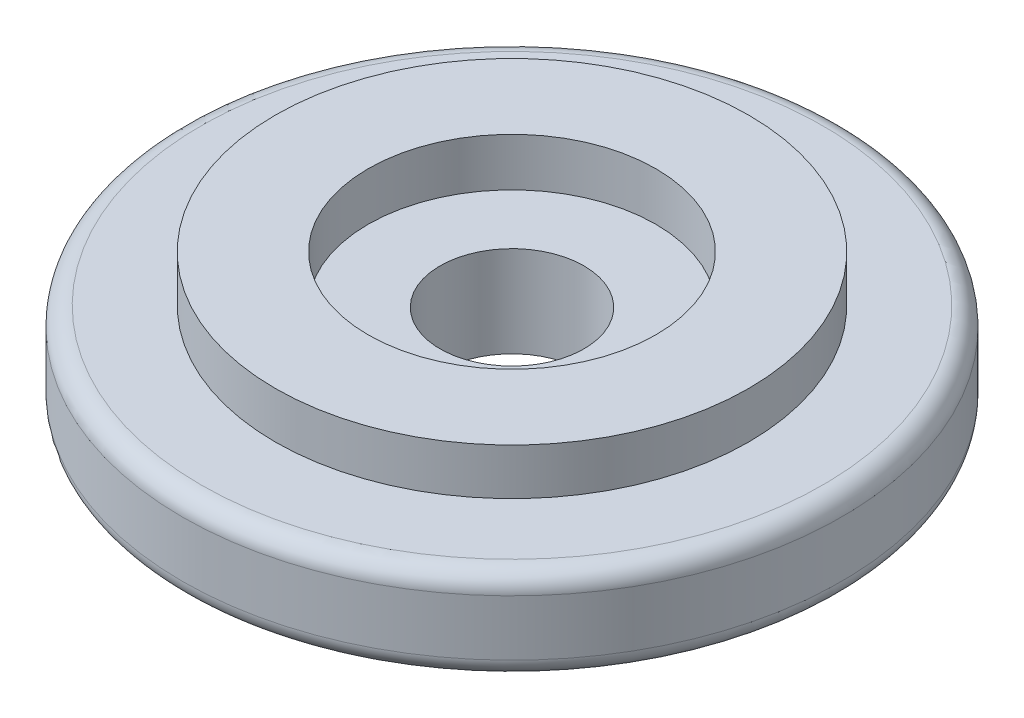
ISO-10303-21;
HEADER;
FILE_DESCRIPTION(('STEP AP214'),'2;1');
FILE_NAME('part.step','',(''),(''),'','','');
FILE_SCHEMA(('AUTOMOTIVE_DESIGN { 1 0 10303 214 1 1 1 1 }'));
ENDSEC;
DATA;
#1=APPLICATION_CONTEXT('core data for automotive mechanical design processes');
#2=APPLICATION_PROTOCOL_DEFINITION('international standard','automotive_design',2000,#1);
#3=PRODUCT_CONTEXT('',#1,'mechanical');
#4=PRODUCT('Part','Part','',(#3));
#5=PRODUCT_RELATED_PRODUCT_CATEGORY('part','',(#4));
#6=PRODUCT_DEFINITION_FORMATION('','',#4);
#7=PRODUCT_DEFINITION_CONTEXT('part definition',#1,'design');
#8=PRODUCT_DEFINITION('design','',#6,#7);
#9=PRODUCT_DEFINITION_SHAPE('','',#8);
#10=(LENGTH_UNIT() NAMED_UNIT(*) SI_UNIT(.MILLI.,.METRE.));
#11=(NAMED_UNIT(*) PLANE_ANGLE_UNIT() SI_UNIT($,.RADIAN.));
#12=(NAMED_UNIT(*) SI_UNIT($,.STERADIAN.) SOLID_ANGLE_UNIT());
#13=UNCERTAINTY_MEASURE_WITH_UNIT(LENGTH_MEASURE(1.E-05),#10,'distance_accuracy_value','');
#14=(GEOMETRIC_REPRESENTATION_CONTEXT(3) GLOBAL_UNCERTAINTY_ASSIGNED_CONTEXT((#13)) GLOBAL_UNIT_ASSIGNED_CONTEXT((#10,
#11,#12)) REPRESENTATION_CONTEXT('',''));
#15=CARTESIAN_POINT('',(0.,0.,0.));
#16=DIRECTION('',(0.,0.,1.));
#17=DIRECTION('',(1.,0.,0.));
#18=AXIS2_PLACEMENT_3D('',#15,#16,#17);
#19=CARTESIAN_POINT('',(0.,0.,0.));
#20=DIRECTION('',(0.,-1.,0.));
#21=DIRECTION('',(0.,0.,-1.));
#22=AXIS2_PLACEMENT_3D('',#19,#20,#21);
#23=CYLINDRICAL_SURFACE('',#22,1.55);
#24=CARTESIAN_POINT('',(0.,0.202573529411757,0.));
#25=DIRECTION('',(0.,-1.,0.));
#26=DIRECTION('',(0.,0.,-1.));
#27=AXIS2_PLACEMENT_3D('',#24,#25,#26);
#28=CIRCLE('',#27,1.55);
#29=CARTESIAN_POINT('',(0.,0.202573529411757,-1.55));
#30=VERTEX_POINT('',#29);
#31=EDGE_CURVE('E51',#30,#30,#28,.T.);
#32=ORIENTED_EDGE('',*,*,#31,.T.);
#33=EDGE_LOOP('',(#32));
#34=FACE_BOUND('',#33,.T.);
#35=CARTESIAN_POINT('',(0.,2.16544117647058,0.));
#36=DIRECTION('',(0.,-1.,0.));
#37=DIRECTION('',(0.,0.,-1.));
#38=AXIS2_PLACEMENT_3D('',#35,#36,#37);
#39=CIRCLE('',#38,1.55);
#40=CARTESIAN_POINT('',(0.,2.16544117647058,-1.55));
#41=VERTEX_POINT('',#40);
#42=EDGE_CURVE('E66',#41,#41,#39,.T.);
#43=ORIENTED_EDGE('',*,*,#42,.F.);
#44=EDGE_LOOP('',(#43));
#45=FACE_BOUND('',#44,.T.);
#46=ADVANCED_FACE('F31',(#34,#45),#23,.F.);
#47=CARTESIAN_POINT('',(1.55,0.202573529411757,0.));
#48=DIRECTION('',(0.,-1.,0.));
#49=DIRECTION('',(0.,0.,-1.));
#50=AXIS2_PLACEMENT_3D('',#47,#48,#49);
#51=PLANE('',#50);
#52=CARTESIAN_POINT('',(0.,0.202573529411757,0.));
#53=DIRECTION('',(0.,-1.,0.));
#54=DIRECTION('',(0.,0.,-1.));
#55=AXIS2_PLACEMENT_3D('',#52,#53,#54);
#56=CIRCLE('',#55,6.7);
#57=CARTESIAN_POINT('',(0.,0.202573529411757,-6.7));
#58=VERTEX_POINT('',#57);
#59=EDGE_CURVE('E46',#58,#58,#56,.T.);
#60=ORIENTED_EDGE('',*,*,#59,.T.);
#61=EDGE_LOOP('',(#60));
#62=FACE_BOUND('',#61,.T.);
#63=ORIENTED_EDGE('',*,*,#31,.F.);
#64=EDGE_LOOP('',(#63));
#65=FACE_BOUND('',#64,.T.);
#66=ADVANCED_FACE('F74',(#62,#65),#51,.T.);
#67=CARTESIAN_POINT('',(0.,0.,0.));
#68=DIRECTION('',(0.,-1.,0.));
#69=DIRECTION('',(0.,0.,-1.));
#70=AXIS2_PLACEMENT_3D('',#67,#68,#69);
#71=CYLINDRICAL_SURFACE('',#70,7.1);
#72=CARTESIAN_POINT('',(0.,0.602573529411757,0.));
#73=DIRECTION('',(0.,-1.,0.));
#74=DIRECTION('',(0.,0.,-1.));
#75=AXIS2_PLACEMENT_3D('',#72,#73,#74);
#76=CIRCLE('',#75,7.1);
#77=CARTESIAN_POINT('',(0.,0.602573529411757,-7.1));
#78=VERTEX_POINT('',#77);
#79=EDGE_CURVE('E38',#78,#78,#76,.F.);
#80=ORIENTED_EDGE('',*,*,#79,.T.);
#81=EDGE_LOOP('',(#80));
#82=FACE_BOUND('',#81,.T.);
#83=CARTESIAN_POINT('',(0.,1.80257352941176,0.));
#84=DIRECTION('',(0.,1.,0.));
#85=DIRECTION('',(0.,0.,1.));
#86=AXIS2_PLACEMENT_3D('',#83,#84,#85);
#87=CIRCLE('',#86,7.1);
#88=CARTESIAN_POINT('',(0.,1.80257352941176,7.1));
#89=VERTEX_POINT('',#88);
#90=EDGE_CURVE('E42',#89,#89,#87,.F.);
#91=ORIENTED_EDGE('',*,*,#90,.T.);
#92=EDGE_LOOP('',(#91));
#93=FACE_BOUND('',#92,.T.);
#94=ADVANCED_FACE('F80',(#82,#93),#71,.T.);
#95=CARTESIAN_POINT('',(7.1,2.20257352941176,0.));
#96=DIRECTION('',(0.,1.,0.));
#97=DIRECTION('',(0.,0.,1.));
#98=AXIS2_PLACEMENT_3D('',#95,#96,#97);
#99=PLANE('',#98);
#100=CARTESIAN_POINT('',(0.,2.20257352941176,0.));
#101=DIRECTION('',(0.,1.,0.));
#102=DIRECTION('',(0.,0.,1.));
#103=AXIS2_PLACEMENT_3D('',#100,#101,#102);
#104=CIRCLE('',#103,6.7);
#105=CARTESIAN_POINT('',(0.,2.20257352941176,6.7));
#106=VERTEX_POINT('',#105);
#107=EDGE_CURVE('E10',#106,#106,#104,.T.);
#108=ORIENTED_EDGE('',*,*,#107,.T.);
#109=EDGE_LOOP('',(#108));
#110=FACE_BOUND('',#109,.T.);
#111=CARTESIAN_POINT('',(0.,2.20257352941176,0.));
#112=DIRECTION('',(0.,-1.,0.));
#113=DIRECTION('',(0.,0.,-1.));
#114=AXIS2_PLACEMENT_3D('',#111,#112,#113);
#115=CIRCLE('',#114,5.1);
#116=CARTESIAN_POINT('',(0.,2.20257352941176,-5.1));
#117=VERTEX_POINT('',#116);
#118=EDGE_CURVE('E54',#117,#117,#115,.T.);
#119=ORIENTED_EDGE('',*,*,#118,.T.);
#120=EDGE_LOOP('',(#119));
#121=FACE_BOUND('',#120,.T.);
#122=ADVANCED_FACE('F111',(#110,#121),#99,.T.);
#123=CARTESIAN_POINT('',(0.,0.,0.));
#124=DIRECTION('',(0.,-1.,0.));
#125=DIRECTION('',(0.,0.,-1.));
#126=AXIS2_PLACEMENT_3D('',#123,#124,#125);
#127=CYLINDRICAL_SURFACE('',#126,5.1);
#128=CARTESIAN_POINT('',(0.,3.20257352941176,0.));
#129=DIRECTION('',(0.,-1.,0.));
#130=DIRECTION('',(0.,0.,-1.));
#131=AXIS2_PLACEMENT_3D('',#128,#129,#130);
#132=CIRCLE('',#131,5.1);
#133=CARTESIAN_POINT('',(0.,3.20257352941176,-5.1));
#134=VERTEX_POINT('',#133);
#135=EDGE_CURVE('E57',#134,#134,#132,.T.);
#136=ORIENTED_EDGE('',*,*,#135,.T.);
#137=EDGE_LOOP('',(#136));
#138=FACE_BOUND('',#137,.T.);
#139=ORIENTED_EDGE('',*,*,#118,.F.);
#140=EDGE_LOOP('',(#139));
#141=FACE_BOUND('',#140,.T.);
#142=ADVANCED_FACE('F107',(#138,#141),#127,.T.);
#143=CARTESIAN_POINT('',(5.1,3.20257352941176,0.));
#144=DIRECTION('',(0.,1.,0.));
#145=DIRECTION('',(0.,0.,1.));
#146=AXIS2_PLACEMENT_3D('',#143,#144,#145);
#147=PLANE('',#146);
#148=CARTESIAN_POINT('',(0.,3.20257352941176,0.));
#149=DIRECTION('',(0.,-1.,0.));
#150=DIRECTION('',(0.,0.,-1.));
#151=AXIS2_PLACEMENT_3D('',#148,#149,#150);
#152=CIRCLE('',#151,3.1);
#153=CARTESIAN_POINT('',(0.,3.20257352941176,-3.1));
#154=VERTEX_POINT('',#153);
#155=EDGE_CURVE('E60',#154,#154,#152,.T.);
#156=ORIENTED_EDGE('',*,*,#155,.T.);
#157=EDGE_LOOP('',(#156));
#158=FACE_BOUND('',#157,.T.);
#159=ORIENTED_EDGE('',*,*,#135,.F.);
#160=EDGE_LOOP('',(#159));
#161=FACE_BOUND('',#160,.T.);
#162=ADVANCED_FACE('F101',(#158,#161),#147,.T.);
#163=CARTESIAN_POINT('',(0.,0.,0.));
#164=DIRECTION('',(0.,-1.,0.));
#165=DIRECTION('',(0.,0.,-1.));
#166=AXIS2_PLACEMENT_3D('',#163,#164,#165);
#167=CYLINDRICAL_SURFACE('',#166,3.1);
#168=CARTESIAN_POINT('',(0.,2.16544117647058,0.));
#169=DIRECTION('',(0.,-1.,0.));
#170=DIRECTION('',(0.,0.,-1.));
#171=AXIS2_PLACEMENT_3D('',#168,#169,#170);
#172=CIRCLE('',#171,3.1);
#173=CARTESIAN_POINT('',(0.,2.16544117647058,-3.1));
#174=VERTEX_POINT('',#173);
#175=EDGE_CURVE('E63',#174,#174,#172,.T.);
#176=ORIENTED_EDGE('',*,*,#175,.T.);
#177=EDGE_LOOP('',(#176));
#178=FACE_BOUND('',#177,.T.);
#179=ORIENTED_EDGE('',*,*,#155,.F.);
#180=EDGE_LOOP('',(#179));
#181=FACE_BOUND('',#180,.T.);
#182=ADVANCED_FACE('F92',(#178,#181),#167,.F.);
#183=CARTESIAN_POINT('',(3.1,2.16544117647058,0.));
#184=DIRECTION('',(0.,1.,0.));
#185=DIRECTION('',(0.,0.,1.));
#186=AXIS2_PLACEMENT_3D('',#183,#184,#185);
#187=PLANE('',#186);
#188=ORIENTED_EDGE('',*,*,#42,.T.);
#189=EDGE_LOOP('',(#188));
#190=FACE_BOUND('',#189,.T.);
#191=ORIENTED_EDGE('',*,*,#175,.F.);
#192=EDGE_LOOP('',(#191));
#193=FACE_BOUND('',#192,.T.);
#194=ADVANCED_FACE('F70',(#190,#193),#187,.T.);
#195=CARTESIAN_POINT('',(0.,0.602573529411757,0.));
#196=DIRECTION('',(0.,-1.,0.));
#197=DIRECTION('',(0.,0.,-1.));
#198=AXIS2_PLACEMENT_3D('',#195,#196,#197);
#199=TOROIDAL_SURFACE('',#198,6.7,0.4);
#200=ORIENTED_EDGE('',*,*,#79,.F.);
#201=EDGE_LOOP('',(#200));
#202=FACE_BOUND('',#201,.T.);
#203=ORIENTED_EDGE('',*,*,#59,.F.);
#204=EDGE_LOOP('',(#203));
#205=FACE_BOUND('',#204,.T.);
#206=ADVANCED_FACE('F84',(#202,#205),#199,.T.);
#207=CARTESIAN_POINT('',(0.,1.80257352941176,0.));
#208=DIRECTION('',(0.,1.,0.));
#209=DIRECTION('',(0.,0.,1.));
#210=AXIS2_PLACEMENT_3D('',#207,#208,#209);
#211=TOROIDAL_SURFACE('',#210,6.7,0.4);
#212=ORIENTED_EDGE('',*,*,#107,.F.);
#213=EDGE_LOOP('',(#212));
#214=FACE_BOUND('',#213,.T.);
#215=ORIENTED_EDGE('',*,*,#90,.F.);
#216=EDGE_LOOP('',(#215));
#217=FACE_BOUND('',#216,.T.);
#218=ADVANCED_FACE('F33',(#214,#217),#211,.T.);
#219=CLOSED_SHELL('',(#46,#66,#94,#122,#142,#162,#182,#194,#206,#218));
#220=MANIFOLD_SOLID_BREP('B2',#219);
#221=ADVANCED_BREP_SHAPE_REPRESENTATION('',(#18,#220),#14);
#222=SHAPE_DEFINITION_REPRESENTATION(#9,#221);
ENDSEC;
END-ISO-10303-21;
